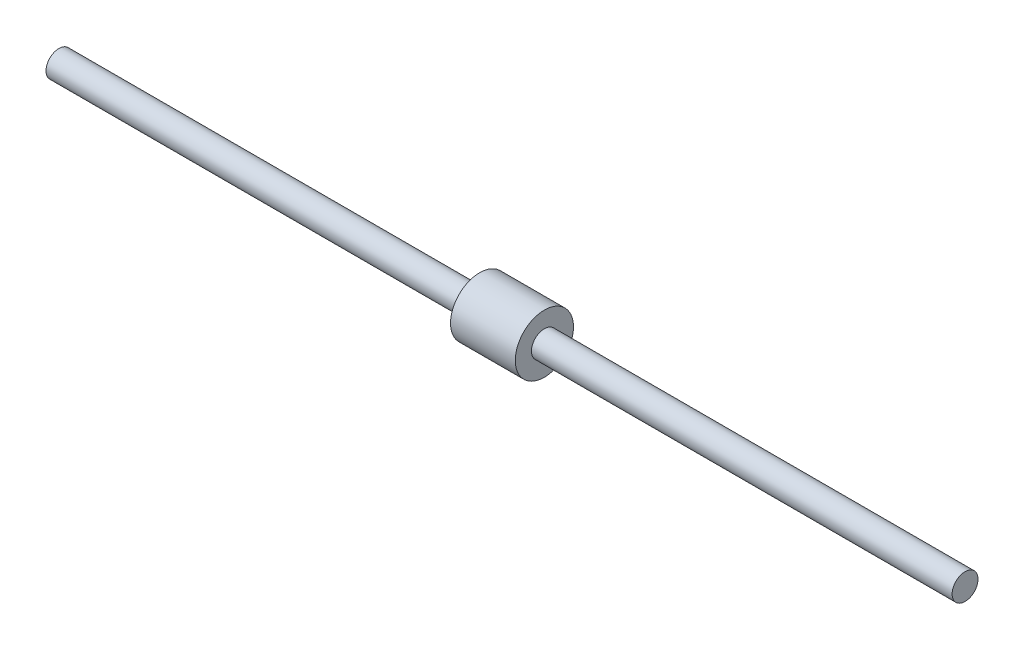
ISO-10303-21;
HEADER;
FILE_DESCRIPTION(('STEP AP214'),'2;1');
FILE_NAME('part.step','',(''),(''),'','','');
FILE_SCHEMA(('AUTOMOTIVE_DESIGN { 1 0 10303 214 1 1 1 1 }'));
ENDSEC;
DATA;
#1=APPLICATION_CONTEXT('core data for automotive mechanical design processes');
#2=APPLICATION_PROTOCOL_DEFINITION('international standard','automotive_design',2000,#1);
#3=PRODUCT_CONTEXT('',#1,'mechanical');
#4=PRODUCT('Part','Part','',(#3));
#5=PRODUCT_RELATED_PRODUCT_CATEGORY('part','',(#4));
#6=PRODUCT_DEFINITION_FORMATION('','',#4);
#7=PRODUCT_DEFINITION_CONTEXT('part definition',#1,'design');
#8=PRODUCT_DEFINITION('design','',#6,#7);
#9=PRODUCT_DEFINITION_SHAPE('','',#8);
#10=(LENGTH_UNIT() NAMED_UNIT(*) SI_UNIT(.MILLI.,.METRE.));
#11=(NAMED_UNIT(*) PLANE_ANGLE_UNIT() SI_UNIT($,.RADIAN.));
#12=(NAMED_UNIT(*) SI_UNIT($,.STERADIAN.) SOLID_ANGLE_UNIT());
#13=UNCERTAINTY_MEASURE_WITH_UNIT(LENGTH_MEASURE(1.E-05),#10,'distance_accuracy_value','');
#14=(GEOMETRIC_REPRESENTATION_CONTEXT(3) GLOBAL_UNCERTAINTY_ASSIGNED_CONTEXT((#13)) GLOBAL_UNIT_ASSIGNED_CONTEXT((#10,
#11,#12)) REPRESENTATION_CONTEXT('',''));
#15=CARTESIAN_POINT('',(0.,0.,0.));
#16=DIRECTION('',(0.,0.,1.));
#17=DIRECTION('',(1.,0.,0.));
#18=AXIS2_PLACEMENT_3D('',#15,#16,#17);
#19=CARTESIAN_POINT('',(0.,0.,0.));
#20=DIRECTION('',(1.,0.,0.));
#21=DIRECTION('',(0.,0.,-1.));
#22=AXIS2_PLACEMENT_3D('',#19,#20,#21);
#23=PLANE('',#22);
#24=CARTESIAN_POINT('',(0.,0.,0.));
#25=DIRECTION('',(-1.,0.,0.));
#26=DIRECTION('',(0.,0.,1.));
#27=AXIS2_PLACEMENT_3D('',#24,#25,#26);
#28=CIRCLE('',#27,4.);
#29=CARTESIAN_POINT('',(0.,0.,4.));
#30=VERTEX_POINT('',#29);
#31=EDGE_CURVE('E10',#30,#30,#28,.T.);
#32=ORIENTED_EDGE('',*,*,#31,.T.);
#33=EDGE_LOOP('',(#32));
#34=FACE_BOUND('',#33,.T.);
#35=ADVANCED_FACE('F30',(#34),#23,.F.);
#36=CARTESIAN_POINT('',(0.,0.,0.));
#37=DIRECTION('',(-1.,0.,0.));
#38=DIRECTION('',(0.,0.,1.));
#39=AXIS2_PLACEMENT_3D('',#36,#37,#38);
#40=CYLINDRICAL_SURFACE('',#39,4.);
#41=ORIENTED_EDGE('',*,*,#31,.F.);
#42=EDGE_LOOP('',(#41));
#43=FACE_BOUND('',#42,.T.);
#44=CARTESIAN_POINT('',(130.,0.,0.));
#45=DIRECTION('',(-1.,0.,0.));
#46=DIRECTION('',(0.,0.,1.));
#47=AXIS2_PLACEMENT_3D('',#44,#45,#46);
#48=CIRCLE('',#47,4.);
#49=CARTESIAN_POINT('',(130.,0.,4.));
#50=VERTEX_POINT('',#49);
#51=EDGE_CURVE('E36',#50,#50,#48,.T.);
#52=ORIENTED_EDGE('',*,*,#51,.T.);
#53=EDGE_LOOP('',(#52));
#54=FACE_BOUND('',#53,.T.);
#55=ADVANCED_FACE('F68',(#43,#54),#40,.T.);
#56=CARTESIAN_POINT('',(130.,4.,0.));
#57=DIRECTION('',(1.,0.,0.));
#58=DIRECTION('',(0.,0.,-1.));
#59=AXIS2_PLACEMENT_3D('',#56,#57,#58);
#60=PLANE('',#59);
#61=ORIENTED_EDGE('',*,*,#51,.F.);
#62=EDGE_LOOP('',(#61));
#63=FACE_BOUND('',#62,.T.);
#64=CARTESIAN_POINT('',(130.,0.,0.));
#65=DIRECTION('',(-1.,0.,0.));
#66=DIRECTION('',(0.,0.,1.));
#67=AXIS2_PLACEMENT_3D('',#64,#65,#66);
#68=CIRCLE('',#67,9.);
#69=CARTESIAN_POINT('',(130.,0.,9.));
#70=VERTEX_POINT('',#69);
#71=EDGE_CURVE('E40',#70,#70,#68,.T.);
#72=ORIENTED_EDGE('',*,*,#71,.T.);
#73=EDGE_LOOP('',(#72));
#74=FACE_BOUND('',#73,.T.);
#75=ADVANCED_FACE('F72',(#63,#74),#60,.F.);
#76=CARTESIAN_POINT('',(0.,0.,0.));
#77=DIRECTION('',(-1.,0.,0.));
#78=DIRECTION('',(0.,0.,1.));
#79=AXIS2_PLACEMENT_3D('',#76,#77,#78);
#80=CYLINDRICAL_SURFACE('',#79,9.);
#81=ORIENTED_EDGE('',*,*,#71,.F.);
#82=EDGE_LOOP('',(#81));
#83=FACE_BOUND('',#82,.T.);
#84=CARTESIAN_POINT('',(150.,0.,0.));
#85=DIRECTION('',(-1.,0.,0.));
#86=DIRECTION('',(0.,0.,1.));
#87=AXIS2_PLACEMENT_3D('',#84,#85,#86);
#88=CIRCLE('',#87,9.);
#89=CARTESIAN_POINT('',(150.,0.,9.));
#90=VERTEX_POINT('',#89);
#91=EDGE_CURVE('E44',#90,#90,#88,.T.);
#92=ORIENTED_EDGE('',*,*,#91,.T.);
#93=EDGE_LOOP('',(#92));
#94=FACE_BOUND('',#93,.T.);
#95=ADVANCED_FACE('F77',(#83,#94),#80,.T.);
#96=CARTESIAN_POINT('',(150.,9.,0.));
#97=DIRECTION('',(-1.,0.,0.));
#98=DIRECTION('',(0.,0.,1.));
#99=AXIS2_PLACEMENT_3D('',#96,#97,#98);
#100=PLANE('',#99);
#101=ORIENTED_EDGE('',*,*,#91,.F.);
#102=EDGE_LOOP('',(#101));
#103=FACE_BOUND('',#102,.T.);
#104=CARTESIAN_POINT('',(150.,0.,0.));
#105=DIRECTION('',(-1.,0.,0.));
#106=DIRECTION('',(0.,0.,1.));
#107=AXIS2_PLACEMENT_3D('',#104,#105,#106);
#108=CIRCLE('',#107,4.);
#109=CARTESIAN_POINT('',(150.,0.,4.));
#110=VERTEX_POINT('',#109);
#111=EDGE_CURVE('E49',#110,#110,#108,.T.);
#112=ORIENTED_EDGE('',*,*,#111,.T.);
#113=EDGE_LOOP('',(#112));
#114=FACE_BOUND('',#113,.T.);
#115=ADVANCED_FACE('F64',(#103,#114),#100,.F.);
#116=CARTESIAN_POINT('',(0.,0.,0.));
#117=DIRECTION('',(-1.,0.,0.));
#118=DIRECTION('',(0.,0.,1.));
#119=AXIS2_PLACEMENT_3D('',#116,#117,#118);
#120=CYLINDRICAL_SURFACE('',#119,4.);
#121=ORIENTED_EDGE('',*,*,#111,.F.);
#122=EDGE_LOOP('',(#121));
#123=FACE_BOUND('',#122,.T.);
#124=CARTESIAN_POINT('',(280.,0.,0.));
#125=DIRECTION('',(-1.,0.,0.));
#126=DIRECTION('',(0.,0.,1.));
#127=AXIS2_PLACEMENT_3D('',#124,#125,#126);
#128=CIRCLE('',#127,4.);
#129=CARTESIAN_POINT('',(280.,0.,4.));
#130=VERTEX_POINT('',#129);
#131=EDGE_CURVE('E52',#130,#130,#128,.T.);
#132=ORIENTED_EDGE('',*,*,#131,.T.);
#133=EDGE_LOOP('',(#132));
#134=FACE_BOUND('',#133,.T.);
#135=ADVANCED_FACE('F56',(#123,#134),#120,.T.);
#136=CARTESIAN_POINT('',(280.,4.,0.));
#137=DIRECTION('',(-1.,0.,0.));
#138=DIRECTION('',(0.,0.,1.));
#139=AXIS2_PLACEMENT_3D('',#136,#137,#138);
#140=PLANE('',#139);
#141=ORIENTED_EDGE('',*,*,#131,.F.);
#142=EDGE_LOOP('',(#141));
#143=FACE_BOUND('',#142,.T.);
#144=ADVANCED_FACE('F58',(#143),#140,.F.);
#145=CLOSED_SHELL('',(#35,#55,#75,#95,#115,#135,#144));
#146=MANIFOLD_SOLID_BREP('B2',#145);
#147=ADVANCED_BREP_SHAPE_REPRESENTATION('',(#18,#146),#14);
#148=SHAPE_DEFINITION_REPRESENTATION(#9,#147);
ENDSEC;
END-ISO-10303-21;
